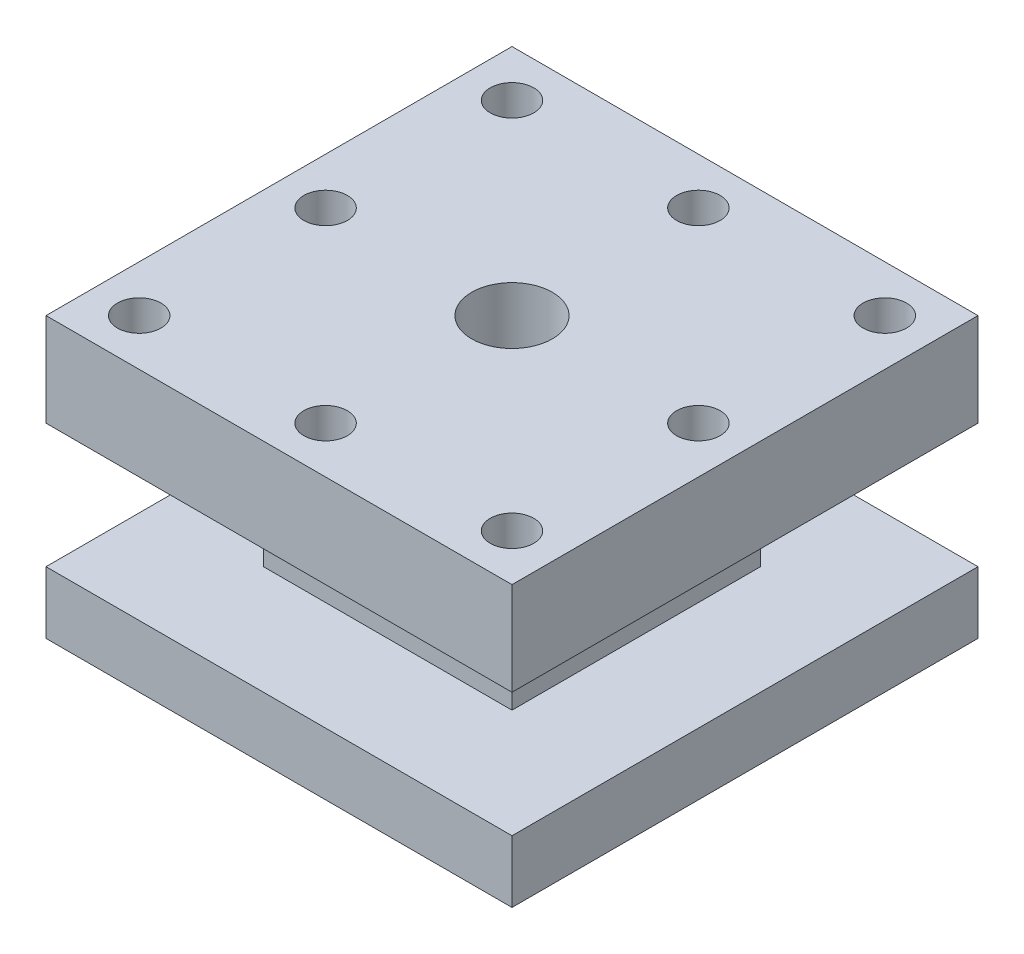
ISO-10303-21;
HEADER;
FILE_DESCRIPTION(('STEP AP214'),'2;1');
FILE_NAME('part.step','',(''),(''),'','','');
FILE_SCHEMA(('AUTOMOTIVE_DESIGN { 1 0 10303 214 1 1 1 1 }'));
ENDSEC;
DATA;
#1=APPLICATION_CONTEXT('core data for automotive mechanical design processes');
#2=APPLICATION_PROTOCOL_DEFINITION('international standard','automotive_design',2000,#1);
#3=PRODUCT_CONTEXT('',#1,'mechanical');
#4=PRODUCT('Part','Part','',(#3));
#5=PRODUCT_RELATED_PRODUCT_CATEGORY('part','',(#4));
#6=PRODUCT_DEFINITION_FORMATION('','',#4);
#7=PRODUCT_DEFINITION_CONTEXT('part definition',#1,'design');
#8=PRODUCT_DEFINITION('design','',#6,#7);
#9=PRODUCT_DEFINITION_SHAPE('','',#8);
#10=(LENGTH_UNIT() NAMED_UNIT(*) SI_UNIT(.MILLI.,.METRE.));
#11=(NAMED_UNIT(*) PLANE_ANGLE_UNIT() SI_UNIT($,.RADIAN.));
#12=(NAMED_UNIT(*) SI_UNIT($,.STERADIAN.) SOLID_ANGLE_UNIT());
#13=UNCERTAINTY_MEASURE_WITH_UNIT(LENGTH_MEASURE(1.E-05),#10,'distance_accuracy_value','');
#14=(GEOMETRIC_REPRESENTATION_CONTEXT(3) GLOBAL_UNCERTAINTY_ASSIGNED_CONTEXT((#13)) GLOBAL_UNIT_ASSIGNED_CONTEXT((#10,
#11,#12)) REPRESENTATION_CONTEXT('',''));
#15=CARTESIAN_POINT('',(0.,0.,0.));
#16=DIRECTION('',(0.,0.,1.));
#17=DIRECTION('',(1.,0.,0.));
#18=AXIS2_PLACEMENT_3D('',#15,#16,#17);
#19=CARTESIAN_POINT('',(0.,-30.,0.));
#20=DIRECTION('',(0.,1.,0.));
#21=DIRECTION('',(0.,0.,1.));
#22=AXIS2_PLACEMENT_3D('',#19,#20,#21);
#23=PLANE('',#22);
#24=CARTESIAN_POINT('',(60.,-30.,60.));
#25=DIRECTION('',(0.,1.,0.));
#26=DIRECTION('',(0.,0.,1.));
#27=AXIS2_PLACEMENT_3D('',#24,#25,#26);
#28=CIRCLE('',#27,7.);
#29=CARTESIAN_POINT('',(60.,-30.,67.));
#30=VERTEX_POINT('',#29);
#31=EDGE_CURVE('E176',#30,#30,#28,.T.);
#32=ORIENTED_EDGE('',*,*,#31,.T.);
#33=EDGE_LOOP('',(#32));
#34=FACE_BOUND('',#33,.T.);
#35=CARTESIAN_POINT('',(-60.,-30.,-60.));
#36=DIRECTION('',(0.,1.,0.));
#37=DIRECTION('',(0.,0.,1.));
#38=AXIS2_PLACEMENT_3D('',#35,#36,#37);
#39=CIRCLE('',#38,7.);
#40=CARTESIAN_POINT('',(-60.,-30.,-53.));
#41=VERTEX_POINT('',#40);
#42=EDGE_CURVE('E182',#41,#41,#39,.T.);
#43=ORIENTED_EDGE('',*,*,#42,.T.);
#44=EDGE_LOOP('',(#43));
#45=FACE_BOUND('',#44,.T.);
#46=CARTESIAN_POINT('',(-60.,-30.,60.));
#47=DIRECTION('',(0.,1.,0.));
#48=DIRECTION('',(0.,0.,1.));
#49=AXIS2_PLACEMENT_3D('',#46,#47,#48);
#50=CIRCLE('',#49,7.);
#51=CARTESIAN_POINT('',(-60.,-30.,67.));
#52=VERTEX_POINT('',#51);
#53=EDGE_CURVE('E188',#52,#52,#50,.T.);
#54=ORIENTED_EDGE('',*,*,#53,.T.);
#55=EDGE_LOOP('',(#54));
#56=FACE_BOUND('',#55,.T.);
#57=CARTESIAN_POINT('',(60.,-30.,-60.));
#58=DIRECTION('',(0.,1.,0.));
#59=DIRECTION('',(0.,0.,1.));
#60=AXIS2_PLACEMENT_3D('',#57,#58,#59);
#61=CIRCLE('',#60,7.);
#62=CARTESIAN_POINT('',(60.,-30.,-53.));
#63=VERTEX_POINT('',#62);
#64=EDGE_CURVE('E194',#63,#63,#61,.T.);
#65=ORIENTED_EDGE('',*,*,#64,.T.);
#66=EDGE_LOOP('',(#65));
#67=FACE_BOUND('',#66,.T.);
#68=CARTESIAN_POINT('',(0.,-30.,-60.));
#69=DIRECTION('',(0.,1.,0.));
#70=DIRECTION('',(0.,0.,1.));
#71=AXIS2_PLACEMENT_3D('',#68,#69,#70);
#72=CIRCLE('',#71,6.99999999999999);
#73=CARTESIAN_POINT('',(0.,-30.,-53.));
#74=VERTEX_POINT('',#73);
#75=EDGE_CURVE('E200',#74,#74,#72,.T.);
#76=ORIENTED_EDGE('',*,*,#75,.T.);
#77=EDGE_LOOP('',(#76));
#78=FACE_BOUND('',#77,.T.);
#79=CARTESIAN_POINT('',(-60.,-30.,0.));
#80=DIRECTION('',(0.,1.,0.));
#81=DIRECTION('',(0.,0.,1.));
#82=AXIS2_PLACEMENT_3D('',#79,#80,#81);
#83=CIRCLE('',#82,7.);
#84=CARTESIAN_POINT('',(-60.,-30.,6.99999999999999));
#85=VERTEX_POINT('',#84);
#86=EDGE_CURVE('E206',#85,#85,#83,.T.);
#87=ORIENTED_EDGE('',*,*,#86,.T.);
#88=EDGE_LOOP('',(#87));
#89=FACE_BOUND('',#88,.T.);
#90=CARTESIAN_POINT('',(0.,-30.,60.));
#91=DIRECTION('',(0.,1.,0.));
#92=DIRECTION('',(0.,0.,1.));
#93=AXIS2_PLACEMENT_3D('',#90,#91,#92);
#94=CIRCLE('',#93,6.99999999999999);
#95=CARTESIAN_POINT('',(0.,-30.,67.));
#96=VERTEX_POINT('',#95);
#97=EDGE_CURVE('E212',#96,#96,#94,.T.);
#98=ORIENTED_EDGE('',*,*,#97,.T.);
#99=EDGE_LOOP('',(#98));
#100=FACE_BOUND('',#99,.T.);
#101=CARTESIAN_POINT('',(60.,-30.,0.));
#102=DIRECTION('',(0.,1.,0.));
#103=DIRECTION('',(0.,0.,1.));
#104=AXIS2_PLACEMENT_3D('',#101,#102,#103);
#105=CIRCLE('',#104,6.99999999999999);
#106=CARTESIAN_POINT('',(60.,-30.,6.99999999999999));
#107=VERTEX_POINT('',#106);
#108=EDGE_CURVE('E218',#107,#107,#105,.T.);
#109=ORIENTED_EDGE('',*,*,#108,.T.);
#110=EDGE_LOOP('',(#109));
#111=FACE_BOUND('',#110,.T.);
#112=DIRECTION('',(0.,0.,-1.));
#113=VECTOR('',#112,1.);
#114=CARTESIAN_POINT('',(75.,-30.,-75.));
#115=LINE('',#114,#113);
#116=CARTESIAN_POINT('',(75.,-30.,75.));
#117=VERTEX_POINT('',#116);
#118=CARTESIAN_POINT('',(75.,-30.,-75.));
#119=VERTEX_POINT('',#118);
#120=EDGE_CURVE('E290',#117,#119,#115,.T.);
#121=ORIENTED_EDGE('',*,*,#120,.F.);
#122=DIRECTION('',(1.,0.,0.));
#123=VECTOR('',#122,1.);
#124=CARTESIAN_POINT('',(-75.,-30.,75.));
#125=LINE('',#124,#123);
#126=CARTESIAN_POINT('',(-75.,-30.,75.));
#127=VERTEX_POINT('',#126);
#128=EDGE_CURVE('E300',#127,#117,#125,.T.);
#129=ORIENTED_EDGE('',*,*,#128,.F.);
#130=DIRECTION('',(0.,0.,1.));
#131=VECTOR('',#130,1.);
#132=CARTESIAN_POINT('',(-75.,-30.,-75.));
#133=LINE('',#132,#131);
#134=CARTESIAN_POINT('',(-75.,-30.,-75.));
#135=VERTEX_POINT('',#134);
#136=EDGE_CURVE('E297',#135,#127,#133,.T.);
#137=ORIENTED_EDGE('',*,*,#136,.F.);
#138=DIRECTION('',(-1.,0.,0.));
#139=VECTOR('',#138,1.);
#140=CARTESIAN_POINT('',(-75.,-30.,-75.));
#141=LINE('',#140,#139);
#142=EDGE_CURVE('E293',#119,#135,#141,.T.);
#143=ORIENTED_EDGE('',*,*,#142,.F.);
#144=EDGE_LOOP('',(#121,#129,#137,#143));
#145=FACE_BOUND('',#144,.T.);
#146=DIRECTION('',(0.,0.,1.));
#147=VECTOR('',#146,1.);
#148=CARTESIAN_POINT('',(40.,-30.,40.));
#149=LINE('',#148,#147);
#150=CARTESIAN_POINT('',(40.,-30.,-40.));
#151=VERTEX_POINT('',#150);
#152=CARTESIAN_POINT('',(40.,-30.,40.));
#153=VERTEX_POINT('',#152);
#154=EDGE_CURVE('E58',#151,#153,#149,.T.);
#155=ORIENTED_EDGE('',*,*,#154,.F.);
#156=DIRECTION('',(1.,0.,0.));
#157=VECTOR('',#156,1.);
#158=CARTESIAN_POINT('',(-40.,-30.,-40.));
#159=LINE('',#158,#157);
#160=CARTESIAN_POINT('',(-40.,-30.,-40.));
#161=VERTEX_POINT('',#160);
#162=EDGE_CURVE('E62',#161,#151,#159,.T.);
#163=ORIENTED_EDGE('',*,*,#162,.F.);
#164=DIRECTION('',(0.,0.,-1.));
#165=VECTOR('',#164,1.);
#166=CARTESIAN_POINT('',(-40.,-30.,40.));
#167=LINE('',#166,#165);
#168=CARTESIAN_POINT('',(-40.,-30.,40.));
#169=VERTEX_POINT('',#168);
#170=EDGE_CURVE('E275',#169,#161,#167,.T.);
#171=ORIENTED_EDGE('',*,*,#170,.F.);
#172=DIRECTION('',(-1.,0.,0.));
#173=VECTOR('',#172,1.);
#174=CARTESIAN_POINT('',(-40.,-30.,40.));
#175=LINE('',#174,#173);
#176=EDGE_CURVE('E272',#153,#169,#175,.T.);
#177=ORIENTED_EDGE('',*,*,#176,.F.);
#178=EDGE_LOOP('',(#155,#163,#171,#177));
#179=FACE_BOUND('',#178,.T.);
#180=ADVANCED_FACE('F42',(#34,#45,#56,#67,#78,#89,#100,#111,#145,#179),#23,.F.);
#181=CARTESIAN_POINT('',(75.,-30.,-75.));
#182=DIRECTION('',(1.,0.,0.));
#183=DIRECTION('',(0.,0.,-1.));
#184=AXIS2_PLACEMENT_3D('',#181,#182,#183);
#185=PLANE('',#184);
#186=DIRECTION('',(0.,0.,-1.));
#187=VECTOR('',#186,1.);
#188=CARTESIAN_POINT('',(75.,0.,-75.));
#189=LINE('',#188,#187);
#190=CARTESIAN_POINT('',(75.,0.,75.));
#191=VERTEX_POINT('',#190);
#192=CARTESIAN_POINT('',(75.,0.,-75.));
#193=VERTEX_POINT('',#192);
#194=EDGE_CURVE('E289',#191,#193,#189,.T.);
#195=ORIENTED_EDGE('',*,*,#194,.F.);
#196=DIRECTION('',(0.,1.,0.));
#197=VECTOR('',#196,1.);
#198=CARTESIAN_POINT('',(75.,-30.,75.));
#199=LINE('',#198,#197);
#200=EDGE_CURVE('E314',#117,#191,#199,.T.);
#201=ORIENTED_EDGE('',*,*,#200,.F.);
#202=ORIENTED_EDGE('',*,*,#120,.T.);
#203=DIRECTION('',(0.,1.,0.));
#204=VECTOR('',#203,1.);
#205=CARTESIAN_POINT('',(75.,-30.,-75.));
#206=LINE('',#205,#204);
#207=EDGE_CURVE('E303',#119,#193,#206,.T.);
#208=ORIENTED_EDGE('',*,*,#207,.T.);
#209=EDGE_LOOP('',(#195,#201,#202,#208));
#210=FACE_BOUND('',#209,.T.);
#211=ADVANCED_FACE('F336',(#210),#185,.T.);
#212=CARTESIAN_POINT('',(-75.,-30.,75.));
#213=DIRECTION('',(0.,0.,1.));
#214=DIRECTION('',(1.,0.,0.));
#215=AXIS2_PLACEMENT_3D('',#212,#213,#214);
#216=PLANE('',#215);
#217=DIRECTION('',(1.,0.,0.));
#218=VECTOR('',#217,1.);
#219=CARTESIAN_POINT('',(-75.,0.,75.));
#220=LINE('',#219,#218);
#221=CARTESIAN_POINT('',(-75.,0.,75.));
#222=VERTEX_POINT('',#221);
#223=EDGE_CURVE('E294',#222,#191,#220,.T.);
#224=ORIENTED_EDGE('',*,*,#223,.F.);
#225=DIRECTION('',(0.,1.,0.));
#226=VECTOR('',#225,1.);
#227=CARTESIAN_POINT('',(-75.,-30.,75.));
#228=LINE('',#227,#226);
#229=EDGE_CURVE('E316',#127,#222,#228,.T.);
#230=ORIENTED_EDGE('',*,*,#229,.F.);
#231=ORIENTED_EDGE('',*,*,#128,.T.);
#232=ORIENTED_EDGE('',*,*,#200,.T.);
#233=EDGE_LOOP('',(#224,#230,#231,#232));
#234=FACE_BOUND('',#233,.T.);
#235=ADVANCED_FACE('F342',(#234),#216,.T.);
#236=CARTESIAN_POINT('',(-75.,-30.,-75.));
#237=DIRECTION('',(-1.,0.,0.));
#238=DIRECTION('',(0.,0.,1.));
#239=AXIS2_PLACEMENT_3D('',#236,#237,#238);
#240=PLANE('',#239);
#241=DIRECTION('',(0.,0.,1.));
#242=VECTOR('',#241,1.);
#243=CARTESIAN_POINT('',(-75.,0.,-75.));
#244=LINE('',#243,#242);
#245=CARTESIAN_POINT('',(-75.,0.,-75.));
#246=VERTEX_POINT('',#245);
#247=EDGE_CURVE('E309',#246,#222,#244,.T.);
#248=ORIENTED_EDGE('',*,*,#247,.F.);
#249=DIRECTION('',(0.,1.,0.));
#250=VECTOR('',#249,1.);
#251=CARTESIAN_POINT('',(-75.,-30.,-75.));
#252=LINE('',#251,#250);
#253=EDGE_CURVE('E318',#135,#246,#252,.T.);
#254=ORIENTED_EDGE('',*,*,#253,.F.);
#255=ORIENTED_EDGE('',*,*,#136,.T.);
#256=ORIENTED_EDGE('',*,*,#229,.T.);
#257=EDGE_LOOP('',(#248,#254,#255,#256));
#258=FACE_BOUND('',#257,.T.);
#259=ADVANCED_FACE('F356',(#258),#240,.T.);
#260=CARTESIAN_POINT('',(-75.,-30.,-75.));
#261=DIRECTION('',(0.,0.,-1.));
#262=DIRECTION('',(-1.,0.,0.));
#263=AXIS2_PLACEMENT_3D('',#260,#261,#262);
#264=PLANE('',#263);
#265=DIRECTION('',(-1.,0.,0.));
#266=VECTOR('',#265,1.);
#267=CARTESIAN_POINT('',(-75.,0.,-75.));
#268=LINE('',#267,#266);
#269=EDGE_CURVE('E306',#193,#246,#268,.T.);
#270=ORIENTED_EDGE('',*,*,#269,.F.);
#271=ORIENTED_EDGE('',*,*,#207,.F.);
#272=ORIENTED_EDGE('',*,*,#142,.T.);
#273=ORIENTED_EDGE('',*,*,#253,.T.);
#274=EDGE_LOOP('',(#270,#271,#272,#273));
#275=FACE_BOUND('',#274,.T.);
#276=ADVANCED_FACE('F352',(#275),#264,.T.);
#277=CARTESIAN_POINT('',(0.,0.,0.));
#278=DIRECTION('',(0.,1.,0.));
#279=DIRECTION('',(0.,0.,1.));
#280=AXIS2_PLACEMENT_3D('',#277,#278,#279);
#281=PLANE('',#280);
#282=CARTESIAN_POINT('',(60.,0.,60.));
#283=DIRECTION('',(0.,1.,0.));
#284=DIRECTION('',(0.,0.,1.));
#285=AXIS2_PLACEMENT_3D('',#282,#283,#284);
#286=CIRCLE('',#285,7.);
#287=CARTESIAN_POINT('',(60.,0.,67.));
#288=VERTEX_POINT('',#287);
#289=EDGE_CURVE('E173',#288,#288,#286,.T.);
#290=ORIENTED_EDGE('',*,*,#289,.F.);
#291=EDGE_LOOP('',(#290));
#292=FACE_BOUND('',#291,.T.);
#293=CARTESIAN_POINT('',(-60.,0.,-60.));
#294=DIRECTION('',(0.,1.,0.));
#295=DIRECTION('',(0.,0.,1.));
#296=AXIS2_PLACEMENT_3D('',#293,#294,#295);
#297=CIRCLE('',#296,7.);
#298=CARTESIAN_POINT('',(-60.,0.,-53.));
#299=VERTEX_POINT('',#298);
#300=EDGE_CURVE('E179',#299,#299,#297,.T.);
#301=ORIENTED_EDGE('',*,*,#300,.F.);
#302=EDGE_LOOP('',(#301));
#303=FACE_BOUND('',#302,.T.);
#304=CARTESIAN_POINT('',(-60.,0.,60.));
#305=DIRECTION('',(0.,1.,0.));
#306=DIRECTION('',(0.,0.,1.));
#307=AXIS2_PLACEMENT_3D('',#304,#305,#306);
#308=CIRCLE('',#307,7.);
#309=CARTESIAN_POINT('',(-60.,0.,67.));
#310=VERTEX_POINT('',#309);
#311=EDGE_CURVE('E185',#310,#310,#308,.T.);
#312=ORIENTED_EDGE('',*,*,#311,.F.);
#313=EDGE_LOOP('',(#312));
#314=FACE_BOUND('',#313,.T.);
#315=CARTESIAN_POINT('',(60.,0.,-60.));
#316=DIRECTION('',(0.,1.,0.));
#317=DIRECTION('',(0.,0.,1.));
#318=AXIS2_PLACEMENT_3D('',#315,#316,#317);
#319=CIRCLE('',#318,7.);
#320=CARTESIAN_POINT('',(60.,0.,-53.));
#321=VERTEX_POINT('',#320);
#322=EDGE_CURVE('E191',#321,#321,#319,.T.);
#323=ORIENTED_EDGE('',*,*,#322,.F.);
#324=EDGE_LOOP('',(#323));
#325=FACE_BOUND('',#324,.T.);
#326=CARTESIAN_POINT('',(0.,0.,-60.));
#327=DIRECTION('',(0.,1.,0.));
#328=DIRECTION('',(0.,0.,1.));
#329=AXIS2_PLACEMENT_3D('',#326,#327,#328);
#330=CIRCLE('',#329,7.);
#331=CARTESIAN_POINT('',(0.,0.,-53.));
#332=VERTEX_POINT('',#331);
#333=EDGE_CURVE('E197',#332,#332,#330,.T.);
#334=ORIENTED_EDGE('',*,*,#333,.F.);
#335=EDGE_LOOP('',(#334));
#336=FACE_BOUND('',#335,.T.);
#337=CARTESIAN_POINT('',(-60.,0.,0.));
#338=DIRECTION('',(0.,1.,0.));
#339=DIRECTION('',(0.,0.,1.));
#340=AXIS2_PLACEMENT_3D('',#337,#338,#339);
#341=CIRCLE('',#340,7.);
#342=CARTESIAN_POINT('',(-60.,0.,6.99999999999999));
#343=VERTEX_POINT('',#342);
#344=EDGE_CURVE('E203',#343,#343,#341,.T.);
#345=ORIENTED_EDGE('',*,*,#344,.F.);
#346=EDGE_LOOP('',(#345));
#347=FACE_BOUND('',#346,.T.);
#348=CARTESIAN_POINT('',(0.,0.,60.));
#349=DIRECTION('',(0.,1.,0.));
#350=DIRECTION('',(0.,0.,1.));
#351=AXIS2_PLACEMENT_3D('',#348,#349,#350);
#352=CIRCLE('',#351,7.);
#353=CARTESIAN_POINT('',(0.,0.,67.));
#354=VERTEX_POINT('',#353);
#355=EDGE_CURVE('E209',#354,#354,#352,.T.);
#356=ORIENTED_EDGE('',*,*,#355,.F.);
#357=EDGE_LOOP('',(#356));
#358=FACE_BOUND('',#357,.T.);
#359=CARTESIAN_POINT('',(60.,0.,0.));
#360=DIRECTION('',(0.,1.,0.));
#361=DIRECTION('',(0.,0.,1.));
#362=AXIS2_PLACEMENT_3D('',#359,#360,#361);
#363=CIRCLE('',#362,6.99999999999999);
#364=CARTESIAN_POINT('',(60.,0.,6.99999999999999));
#365=VERTEX_POINT('',#364);
#366=EDGE_CURVE('E215',#365,#365,#363,.T.);
#367=ORIENTED_EDGE('',*,*,#366,.F.);
#368=EDGE_LOOP('',(#367));
#369=FACE_BOUND('',#368,.T.);
#370=CARTESIAN_POINT('',(0.,0.,0.));
#371=DIRECTION('',(0.,1.,0.));
#372=DIRECTION('',(0.,0.,1.));
#373=AXIS2_PLACEMENT_3D('',#370,#371,#372);
#374=CIRCLE('',#373,13.);
#375=CARTESIAN_POINT('',(0.,0.,13.));
#376=VERTEX_POINT('',#375);
#377=EDGE_CURVE('E227',#376,#376,#374,.T.);
#378=ORIENTED_EDGE('',*,*,#377,.F.);
#379=EDGE_LOOP('',(#378));
#380=FACE_BOUND('',#379,.T.);
#381=ORIENTED_EDGE('',*,*,#194,.T.);
#382=ORIENTED_EDGE('',*,*,#269,.T.);
#383=ORIENTED_EDGE('',*,*,#247,.T.);
#384=ORIENTED_EDGE('',*,*,#223,.T.);
#385=EDGE_LOOP('',(#381,#382,#383,#384));
#386=FACE_BOUND('',#385,.T.);
#387=ADVANCED_FACE('F349',(#292,#303,#314,#325,#336,#347,#358,#369,#380,#386),#281,.T.);
#388=CARTESIAN_POINT('',(40.,-70.,40.));
#389=DIRECTION('',(-1.,0.,0.));
#390=DIRECTION('',(0.,0.,1.));
#391=AXIS2_PLACEMENT_3D('',#388,#389,#390);
#392=PLANE('',#391);
#393=ORIENTED_EDGE('',*,*,#154,.T.);
#394=DIRECTION('',(0.,1.,0.));
#395=VECTOR('',#394,1.);
#396=CARTESIAN_POINT('',(40.,-70.,40.));
#397=LINE('',#396,#395);
#398=CARTESIAN_POINT('',(40.,-70.,40.));
#399=VERTEX_POINT('',#398);
#400=EDGE_CURVE('E286',#399,#153,#397,.T.);
#401=ORIENTED_EDGE('',*,*,#400,.F.);
#402=DIRECTION('',(0.,0.,1.));
#403=VECTOR('',#402,1.);
#404=CARTESIAN_POINT('',(40.,-70.,40.));
#405=LINE('',#404,#403);
#406=CARTESIAN_POINT('',(40.,-70.,-40.));
#407=VERTEX_POINT('',#406);
#408=EDGE_CURVE('E258',#407,#399,#405,.T.);
#409=ORIENTED_EDGE('',*,*,#408,.F.);
#410=DIRECTION('',(0.,1.,0.));
#411=VECTOR('',#410,1.);
#412=CARTESIAN_POINT('',(40.,-70.,-40.));
#413=LINE('',#412,#411);
#414=EDGE_CURVE('E270',#407,#151,#413,.T.);
#415=ORIENTED_EDGE('',*,*,#414,.T.);
#416=EDGE_LOOP('',(#393,#401,#409,#415));
#417=FACE_BOUND('',#416,.T.);
#418=ADVANCED_FACE('F347',(#417),#392,.F.);
#419=CARTESIAN_POINT('',(-40.,-70.,40.));
#420=DIRECTION('',(0.,0.,-1.));
#421=DIRECTION('',(-1.,0.,0.));
#422=AXIS2_PLACEMENT_3D('',#419,#420,#421);
#423=PLANE('',#422);
#424=ORIENTED_EDGE('',*,*,#176,.T.);
#425=DIRECTION('',(0.,1.,0.));
#426=VECTOR('',#425,1.);
#427=CARTESIAN_POINT('',(-40.,-70.,40.));
#428=LINE('',#427,#426);
#429=CARTESIAN_POINT('',(-40.,-70.,40.));
#430=VERTEX_POINT('',#429);
#431=EDGE_CURVE('E283',#430,#169,#428,.T.);
#432=ORIENTED_EDGE('',*,*,#431,.F.);
#433=DIRECTION('',(-1.,0.,0.));
#434=VECTOR('',#433,1.);
#435=CARTESIAN_POINT('',(-40.,-70.,40.));
#436=LINE('',#435,#434);
#437=EDGE_CURVE('E261',#399,#430,#436,.T.);
#438=ORIENTED_EDGE('',*,*,#437,.F.);
#439=ORIENTED_EDGE('',*,*,#400,.T.);
#440=EDGE_LOOP('',(#424,#432,#438,#439));
#441=FACE_BOUND('',#440,.T.);
#442=ADVANCED_FACE('F389',(#441),#423,.F.);
#443=CARTESIAN_POINT('',(-40.,-70.,40.));
#444=DIRECTION('',(1.,0.,0.));
#445=DIRECTION('',(0.,0.,-1.));
#446=AXIS2_PLACEMENT_3D('',#443,#444,#445);
#447=PLANE('',#446);
#448=ORIENTED_EDGE('',*,*,#170,.T.);
#449=DIRECTION('',(0.,1.,0.));
#450=VECTOR('',#449,1.);
#451=CARTESIAN_POINT('',(-40.,-70.,-40.));
#452=LINE('',#451,#450);
#453=CARTESIAN_POINT('',(-40.,-70.,-40.));
#454=VERTEX_POINT('',#453);
#455=EDGE_CURVE('E280',#454,#161,#452,.T.);
#456=ORIENTED_EDGE('',*,*,#455,.F.);
#457=DIRECTION('',(0.,0.,-1.));
#458=VECTOR('',#457,1.);
#459=CARTESIAN_POINT('',(-40.,-70.,40.));
#460=LINE('',#459,#458);
#461=EDGE_CURVE('E264',#430,#454,#460,.T.);
#462=ORIENTED_EDGE('',*,*,#461,.F.);
#463=ORIENTED_EDGE('',*,*,#431,.T.);
#464=EDGE_LOOP('',(#448,#456,#462,#463));
#465=FACE_BOUND('',#464,.T.);
#466=ADVANCED_FACE('F396',(#465),#447,.F.);
#467=CARTESIAN_POINT('',(-40.,-70.,-40.));
#468=DIRECTION('',(0.,0.,1.));
#469=DIRECTION('',(1.,0.,0.));
#470=AXIS2_PLACEMENT_3D('',#467,#468,#469);
#471=PLANE('',#470);
#472=ORIENTED_EDGE('',*,*,#162,.T.);
#473=ORIENTED_EDGE('',*,*,#414,.F.);
#474=DIRECTION('',(1.,0.,0.));
#475=VECTOR('',#474,1.);
#476=CARTESIAN_POINT('',(-40.,-70.,-40.));
#477=LINE('',#476,#475);
#478=EDGE_CURVE('E267',#454,#407,#477,.T.);
#479=ORIENTED_EDGE('',*,*,#478,.F.);
#480=ORIENTED_EDGE('',*,*,#455,.T.);
#481=EDGE_LOOP('',(#472,#473,#479,#480));
#482=FACE_BOUND('',#481,.T.);
#483=ADVANCED_FACE('F403',(#482),#471,.F.);
#484=CARTESIAN_POINT('',(0.,-70.,0.));
#485=DIRECTION('',(0.,-1.,0.));
#486=DIRECTION('',(0.,0.,-1.));
#487=AXIS2_PLACEMENT_3D('',#484,#485,#486);
#488=PLANE('',#487);
#489=DIRECTION('',(0.,0.,-1.));
#490=VECTOR('',#489,1.);
#491=CARTESIAN_POINT('',(-75.,-70.,75.));
#492=LINE('',#491,#490);
#493=CARTESIAN_POINT('',(-75.,-70.,75.));
#494=VERTEX_POINT('',#493);
#495=CARTESIAN_POINT('',(-75.,-70.,-75.));
#496=VERTEX_POINT('',#495);
#497=EDGE_CURVE('E239',#494,#496,#492,.T.);
#498=ORIENTED_EDGE('',*,*,#497,.F.);
#499=DIRECTION('',(-1.,0.,0.));
#500=VECTOR('',#499,1.);
#501=CARTESIAN_POINT('',(75.,-70.,75.));
#502=LINE('',#501,#500);
#503=CARTESIAN_POINT('',(75.,-70.,75.));
#504=VERTEX_POINT('',#503);
#505=EDGE_CURVE('E232',#504,#494,#502,.T.);
#506=ORIENTED_EDGE('',*,*,#505,.F.);
#507=DIRECTION('',(0.,0.,1.));
#508=VECTOR('',#507,1.);
#509=CARTESIAN_POINT('',(75.,-70.,-75.));
#510=LINE('',#509,#508);
#511=CARTESIAN_POINT('',(75.,-70.,-75.));
#512=VERTEX_POINT('',#511);
#513=EDGE_CURVE('E244',#512,#504,#510,.T.);
#514=ORIENTED_EDGE('',*,*,#513,.F.);
#515=DIRECTION('',(1.,0.,0.));
#516=VECTOR('',#515,1.);
#517=CARTESIAN_POINT('',(-75.,-70.,-75.));
#518=LINE('',#517,#516);
#519=EDGE_CURVE('E242',#496,#512,#518,.T.);
#520=ORIENTED_EDGE('',*,*,#519,.F.);
#521=EDGE_LOOP('',(#498,#506,#514,#520));
#522=FACE_BOUND('',#521,.T.);
#523=ORIENTED_EDGE('',*,*,#478,.T.);
#524=ORIENTED_EDGE('',*,*,#408,.T.);
#525=ORIENTED_EDGE('',*,*,#437,.T.);
#526=ORIENTED_EDGE('',*,*,#461,.T.);
#527=EDGE_LOOP('',(#523,#524,#525,#526));
#528=FACE_BOUND('',#527,.T.);
#529=ADVANCED_FACE('F411',(#522,#528),#488,.F.);
#530=CARTESIAN_POINT('',(-75.,-90.,75.));
#531=DIRECTION('',(1.,0.,0.));
#532=DIRECTION('',(0.,0.,-1.));
#533=AXIS2_PLACEMENT_3D('',#530,#531,#532);
#534=PLANE('',#533);
#535=ORIENTED_EDGE('',*,*,#497,.T.);
#536=DIRECTION('',(0.,1.,0.));
#537=VECTOR('',#536,1.);
#538=CARTESIAN_POINT('',(-75.,-90.,-75.));
#539=LINE('',#538,#537);
#540=CARTESIAN_POINT('',(-75.,-90.,-75.));
#541=VERTEX_POINT('',#540);
#542=EDGE_CURVE('E255',#541,#496,#539,.T.);
#543=ORIENTED_EDGE('',*,*,#542,.F.);
#544=DIRECTION('',(0.,0.,-1.));
#545=VECTOR('',#544,1.);
#546=CARTESIAN_POINT('',(-75.,-90.,75.));
#547=LINE('',#546,#545);
#548=CARTESIAN_POINT('',(-75.,-90.,75.));
#549=VERTEX_POINT('',#548);
#550=EDGE_CURVE('E228',#549,#541,#547,.T.);
#551=ORIENTED_EDGE('',*,*,#550,.F.);
#552=DIRECTION('',(0.,1.,0.));
#553=VECTOR('',#552,1.);
#554=CARTESIAN_POINT('',(-75.,-90.,75.));
#555=LINE('',#554,#553);
#556=EDGE_CURVE('E238',#549,#494,#555,.T.);
#557=ORIENTED_EDGE('',*,*,#556,.T.);
#558=EDGE_LOOP('',(#535,#543,#551,#557));
#559=FACE_BOUND('',#558,.T.);
#560=ADVANCED_FACE('F419',(#559),#534,.F.);
#561=CARTESIAN_POINT('',(-75.,-90.,-75.));
#562=DIRECTION('',(0.,0.,1.));
#563=DIRECTION('',(1.,0.,0.));
#564=AXIS2_PLACEMENT_3D('',#561,#562,#563);
#565=PLANE('',#564);
#566=ORIENTED_EDGE('',*,*,#519,.T.);
#567=DIRECTION('',(0.,1.,0.));
#568=VECTOR('',#567,1.);
#569=CARTESIAN_POINT('',(75.,-90.,-75.));
#570=LINE('',#569,#568);
#571=CARTESIAN_POINT('',(75.,-90.,-75.));
#572=VERTEX_POINT('',#571);
#573=EDGE_CURVE('E252',#572,#512,#570,.T.);
#574=ORIENTED_EDGE('',*,*,#573,.F.);
#575=DIRECTION('',(1.,0.,0.));
#576=VECTOR('',#575,1.);
#577=CARTESIAN_POINT('',(-75.,-90.,-75.));
#578=LINE('',#577,#576);
#579=EDGE_CURVE('E231',#541,#572,#578,.T.);
#580=ORIENTED_EDGE('',*,*,#579,.F.);
#581=ORIENTED_EDGE('',*,*,#542,.T.);
#582=EDGE_LOOP('',(#566,#574,#580,#581));
#583=FACE_BOUND('',#582,.T.);
#584=ADVANCED_FACE('F427',(#583),#565,.F.);
#585=CARTESIAN_POINT('',(75.,-90.,-75.));
#586=DIRECTION('',(-1.,0.,0.));
#587=DIRECTION('',(0.,0.,1.));
#588=AXIS2_PLACEMENT_3D('',#585,#586,#587);
#589=PLANE('',#588);
#590=ORIENTED_EDGE('',*,*,#513,.T.);
#591=DIRECTION('',(0.,1.,0.));
#592=VECTOR('',#591,1.);
#593=CARTESIAN_POINT('',(75.,-90.,75.));
#594=LINE('',#593,#592);
#595=CARTESIAN_POINT('',(75.,-90.,75.));
#596=VERTEX_POINT('',#595);
#597=EDGE_CURVE('E249',#596,#504,#594,.T.);
#598=ORIENTED_EDGE('',*,*,#597,.F.);
#599=DIRECTION('',(0.,0.,1.));
#600=VECTOR('',#599,1.);
#601=CARTESIAN_POINT('',(75.,-90.,-75.));
#602=LINE('',#601,#600);
#603=EDGE_CURVE('E234',#572,#596,#602,.T.);
#604=ORIENTED_EDGE('',*,*,#603,.F.);
#605=ORIENTED_EDGE('',*,*,#573,.T.);
#606=EDGE_LOOP('',(#590,#598,#604,#605));
#607=FACE_BOUND('',#606,.T.);
#608=ADVANCED_FACE('F435',(#607),#589,.F.);
#609=CARTESIAN_POINT('',(75.,-90.,75.));
#610=DIRECTION('',(0.,0.,-1.));
#611=DIRECTION('',(-1.,0.,0.));
#612=AXIS2_PLACEMENT_3D('',#609,#610,#611);
#613=PLANE('',#612);
#614=ORIENTED_EDGE('',*,*,#505,.T.);
#615=ORIENTED_EDGE('',*,*,#556,.F.);
#616=DIRECTION('',(-1.,0.,0.));
#617=VECTOR('',#616,1.);
#618=CARTESIAN_POINT('',(75.,-90.,75.));
#619=LINE('',#618,#617);
#620=EDGE_CURVE('E236',#596,#549,#619,.T.);
#621=ORIENTED_EDGE('',*,*,#620,.F.);
#622=ORIENTED_EDGE('',*,*,#597,.T.);
#623=EDGE_LOOP('',(#614,#615,#621,#622));
#624=FACE_BOUND('',#623,.T.);
#625=ADVANCED_FACE('F443',(#624),#613,.F.);
#626=CARTESIAN_POINT('',(0.,-90.,0.));
#627=DIRECTION('',(0.,-1.,0.));
#628=DIRECTION('',(0.,0.,-1.));
#629=AXIS2_PLACEMENT_3D('',#626,#627,#628);
#630=PLANE('',#629);
#631=CARTESIAN_POINT('',(0.,-90.,0.));
#632=DIRECTION('',(0.,-1.,0.));
#633=DIRECTION('',(0.,0.,-1.));
#634=AXIS2_PLACEMENT_3D('',#631,#632,#633);
#635=CIRCLE('',#634,32.0000000000001);
#636=CARTESIAN_POINT('',(0.,-90.,-32.0000000000001));
#637=VERTEX_POINT('',#636);
#638=EDGE_CURVE('E11',#637,#637,#635,.F.);
#639=ORIENTED_EDGE('',*,*,#638,.T.);
#640=EDGE_LOOP('',(#639));
#641=FACE_BOUND('',#640,.T.);
#642=CARTESIAN_POINT('',(0.,-90.,52.));
#643=DIRECTION('',(0.,-1.,0.));
#644=DIRECTION('',(0.,0.,-1.));
#645=AXIS2_PLACEMENT_3D('',#642,#643,#644);
#646=CIRCLE('',#645,4.99999999999999);
#647=CARTESIAN_POINT('',(0.,-90.,47.));
#648=VERTEX_POINT('',#647);
#649=EDGE_CURVE('E151',#648,#648,#646,.T.);
#650=ORIENTED_EDGE('',*,*,#649,.F.);
#651=EDGE_LOOP('',(#650));
#652=FACE_BOUND('',#651,.T.);
#653=CARTESIAN_POINT('',(-52.,-90.,0.));
#654=DIRECTION('',(0.,-1.,0.));
#655=DIRECTION('',(0.,0.,-1.));
#656=AXIS2_PLACEMENT_3D('',#653,#654,#655);
#657=CIRCLE('',#656,4.99999999999999);
#658=CARTESIAN_POINT('',(-52.,-90.,-5.00000000000001));
#659=VERTEX_POINT('',#658);
#660=EDGE_CURVE('E150',#659,#659,#657,.T.);
#661=ORIENTED_EDGE('',*,*,#660,.F.);
#662=EDGE_LOOP('',(#661));
#663=FACE_BOUND('',#662,.T.);
#664=CARTESIAN_POINT('',(0.,-90.,-52.));
#665=DIRECTION('',(0.,-1.,0.));
#666=DIRECTION('',(0.,0.,-1.));
#667=AXIS2_PLACEMENT_3D('',#664,#665,#666);
#668=CIRCLE('',#667,4.99999999999999);
#669=CARTESIAN_POINT('',(0.,-90.,-57.));
#670=VERTEX_POINT('',#669);
#671=EDGE_CURVE('E161',#670,#670,#668,.T.);
#672=ORIENTED_EDGE('',*,*,#671,.F.);
#673=EDGE_LOOP('',(#672));
#674=FACE_BOUND('',#673,.T.);
#675=CARTESIAN_POINT('',(52.,-90.,0.));
#676=DIRECTION('',(0.,-1.,0.));
#677=DIRECTION('',(0.,0.,-1.));
#678=AXIS2_PLACEMENT_3D('',#675,#676,#677);
#679=CIRCLE('',#678,4.99999999999999);
#680=CARTESIAN_POINT('',(52.,-90.,-5.00000000000001));
#681=VERTEX_POINT('',#680);
#682=EDGE_CURVE('E167',#681,#681,#679,.T.);
#683=ORIENTED_EDGE('',*,*,#682,.F.);
#684=EDGE_LOOP('',(#683));
#685=FACE_BOUND('',#684,.T.);
#686=ORIENTED_EDGE('',*,*,#550,.T.);
#687=ORIENTED_EDGE('',*,*,#579,.T.);
#688=ORIENTED_EDGE('',*,*,#603,.T.);
#689=ORIENTED_EDGE('',*,*,#620,.T.);
#690=EDGE_LOOP('',(#686,#687,#688,#689));
#691=FACE_BOUND('',#690,.T.);
#692=ADVANCED_FACE('F451',(#641,#652,#663,#674,#685,#691),#630,.T.);
#693=CARTESIAN_POINT('',(0.,-90.,0.));
#694=DIRECTION('',(0.,-1.,0.));
#695=DIRECTION('',(0.,0.,-1.));
#696=AXIS2_PLACEMENT_3D('',#693,#694,#695);
#697=CYLINDRICAL_SURFACE('',#696,13.);
#698=ORIENTED_EDGE('',*,*,#377,.T.);
#699=EDGE_LOOP('',(#698));
#700=FACE_BOUND('',#699,.T.);
#701=CARTESIAN_POINT('',(0.,-80.,0.));
#702=DIRECTION('',(0.,-1.,0.));
#703=DIRECTION('',(0.,0.,-1.));
#704=AXIS2_PLACEMENT_3D('',#701,#702,#703);
#705=CIRCLE('',#704,13.);
#706=CARTESIAN_POINT('',(0.,-80.,-13.));
#707=VERTEX_POINT('',#706);
#708=EDGE_CURVE('E224',#707,#707,#705,.T.);
#709=ORIENTED_EDGE('',*,*,#708,.T.);
#710=EDGE_LOOP('',(#709));
#711=FACE_BOUND('',#710,.T.);
#712=ADVANCED_FACE('F460',(#700,#711),#697,.F.);
#713=CARTESIAN_POINT('',(13.,-80.,0.));
#714=DIRECTION('',(0.,1.,0.));
#715=DIRECTION('',(0.,0.,1.));
#716=AXIS2_PLACEMENT_3D('',#713,#714,#715);
#717=PLANE('',#716);
#718=ORIENTED_EDGE('',*,*,#708,.F.);
#719=EDGE_LOOP('',(#718));
#720=FACE_BOUND('',#719,.T.);
#721=CARTESIAN_POINT('',(0.,-80.,0.));
#722=DIRECTION('',(0.,-1.,0.));
#723=DIRECTION('',(0.,0.,-1.));
#724=AXIS2_PLACEMENT_3D('',#721,#722,#723);
#725=CIRCLE('',#724,30.);
#726=CARTESIAN_POINT('',(0.,-80.,-30.));
#727=VERTEX_POINT('',#726);
#728=EDGE_CURVE('E221',#727,#727,#725,.T.);
#729=ORIENTED_EDGE('',*,*,#728,.T.);
#730=EDGE_LOOP('',(#729));
#731=FACE_BOUND('',#730,.T.);
#732=ADVANCED_FACE('F469',(#720,#731),#717,.F.);
#733=CARTESIAN_POINT('',(0.,-90.,0.));
#734=DIRECTION('',(0.,-1.,0.));
#735=DIRECTION('',(0.,0.,-1.));
#736=AXIS2_PLACEMENT_3D('',#733,#734,#735);
#737=CYLINDRICAL_SURFACE('',#736,30.);
#738=CARTESIAN_POINT('',(0.,-87.9999999999999,0.));
#739=DIRECTION('',(0.,-1.,0.));
#740=DIRECTION('',(0.,0.,-1.));
#741=AXIS2_PLACEMENT_3D('',#738,#739,#740);
#742=CIRCLE('',#741,30.);
#743=CARTESIAN_POINT('',(0.,-87.9999999999999,-30.));
#744=VERTEX_POINT('',#743);
#745=EDGE_CURVE('E51',#744,#744,#742,.T.);
#746=ORIENTED_EDGE('',*,*,#745,.T.);
#747=EDGE_LOOP('',(#746));
#748=FACE_BOUND('',#747,.T.);
#749=ORIENTED_EDGE('',*,*,#728,.F.);
#750=EDGE_LOOP('',(#749));
#751=FACE_BOUND('',#750,.T.);
#752=ADVANCED_FACE('F325',(#748,#751),#737,.F.);
#753=CARTESIAN_POINT('',(60.,0.,0.));
#754=DIRECTION('',(0.,1.,0.));
#755=DIRECTION('',(0.,0.,1.));
#756=AXIS2_PLACEMENT_3D('',#753,#754,#755);
#757=CYLINDRICAL_SURFACE('',#756,6.99999999999999);
#758=ORIENTED_EDGE('',*,*,#108,.F.);
#759=EDGE_LOOP('',(#758));
#760=FACE_BOUND('',#759,.T.);
#761=ORIENTED_EDGE('',*,*,#366,.T.);
#762=EDGE_LOOP('',(#761));
#763=FACE_BOUND('',#762,.T.);
#764=ADVANCED_FACE('F483',(#760,#763),#757,.F.);
#765=CARTESIAN_POINT('',(0.,0.,60.));
#766=DIRECTION('',(0.,1.,0.));
#767=DIRECTION('',(0.,0.,1.));
#768=AXIS2_PLACEMENT_3D('',#765,#766,#767);
#769=CYLINDRICAL_SURFACE('',#768,6.99999999999999);
#770=ORIENTED_EDGE('',*,*,#97,.F.);
#771=EDGE_LOOP('',(#770));
#772=FACE_BOUND('',#771,.T.);
#773=ORIENTED_EDGE('',*,*,#355,.T.);
#774=EDGE_LOOP('',(#773));
#775=FACE_BOUND('',#774,.T.);
#776=ADVANCED_FACE('F489',(#772,#775),#769,.F.);
#777=CARTESIAN_POINT('',(-60.,0.,0.));
#778=DIRECTION('',(0.,1.,0.));
#779=DIRECTION('',(0.,0.,1.));
#780=AXIS2_PLACEMENT_3D('',#777,#778,#779);
#781=CYLINDRICAL_SURFACE('',#780,7.);
#782=ORIENTED_EDGE('',*,*,#86,.F.);
#783=EDGE_LOOP('',(#782));
#784=FACE_BOUND('',#783,.T.);
#785=ORIENTED_EDGE('',*,*,#344,.T.);
#786=EDGE_LOOP('',(#785));
#787=FACE_BOUND('',#786,.T.);
#788=ADVANCED_FACE('F497',(#784,#787),#781,.F.);
#789=CARTESIAN_POINT('',(0.,0.,-60.));
#790=DIRECTION('',(0.,1.,0.));
#791=DIRECTION('',(0.,0.,1.));
#792=AXIS2_PLACEMENT_3D('',#789,#790,#791);
#793=CYLINDRICAL_SURFACE('',#792,6.99999999999999);
#794=ORIENTED_EDGE('',*,*,#75,.F.);
#795=EDGE_LOOP('',(#794));
#796=FACE_BOUND('',#795,.T.);
#797=ORIENTED_EDGE('',*,*,#333,.T.);
#798=EDGE_LOOP('',(#797));
#799=FACE_BOUND('',#798,.T.);
#800=ADVANCED_FACE('F505',(#796,#799),#793,.F.);
#801=CARTESIAN_POINT('',(60.,0.,-60.));
#802=DIRECTION('',(0.,1.,0.));
#803=DIRECTION('',(0.,0.,1.));
#804=AXIS2_PLACEMENT_3D('',#801,#802,#803);
#805=CYLINDRICAL_SURFACE('',#804,7.);
#806=ORIENTED_EDGE('',*,*,#64,.F.);
#807=EDGE_LOOP('',(#806));
#808=FACE_BOUND('',#807,.T.);
#809=ORIENTED_EDGE('',*,*,#322,.T.);
#810=EDGE_LOOP('',(#809));
#811=FACE_BOUND('',#810,.T.);
#812=ADVANCED_FACE('F513',(#808,#811),#805,.F.);
#813=CARTESIAN_POINT('',(-60.,0.,60.));
#814=DIRECTION('',(0.,1.,0.));
#815=DIRECTION('',(0.,0.,1.));
#816=AXIS2_PLACEMENT_3D('',#813,#814,#815);
#817=CYLINDRICAL_SURFACE('',#816,7.);
#818=ORIENTED_EDGE('',*,*,#53,.F.);
#819=EDGE_LOOP('',(#818));
#820=FACE_BOUND('',#819,.T.);
#821=ORIENTED_EDGE('',*,*,#311,.T.);
#822=EDGE_LOOP('',(#821));
#823=FACE_BOUND('',#822,.T.);
#824=ADVANCED_FACE('F521',(#820,#823),#817,.F.);
#825=CARTESIAN_POINT('',(-60.,0.,-60.));
#826=DIRECTION('',(0.,1.,0.));
#827=DIRECTION('',(0.,0.,1.));
#828=AXIS2_PLACEMENT_3D('',#825,#826,#827);
#829=CYLINDRICAL_SURFACE('',#828,7.);
#830=ORIENTED_EDGE('',*,*,#42,.F.);
#831=EDGE_LOOP('',(#830));
#832=FACE_BOUND('',#831,.T.);
#833=ORIENTED_EDGE('',*,*,#300,.T.);
#834=EDGE_LOOP('',(#833));
#835=FACE_BOUND('',#834,.T.);
#836=ADVANCED_FACE('F529',(#832,#835),#829,.F.);
#837=CARTESIAN_POINT('',(60.,0.,60.));
#838=DIRECTION('',(0.,1.,0.));
#839=DIRECTION('',(0.,0.,1.));
#840=AXIS2_PLACEMENT_3D('',#837,#838,#839);
#841=CYLINDRICAL_SURFACE('',#840,7.);
#842=ORIENTED_EDGE('',*,*,#31,.F.);
#843=EDGE_LOOP('',(#842));
#844=FACE_BOUND('',#843,.T.);
#845=ORIENTED_EDGE('',*,*,#289,.T.);
#846=EDGE_LOOP('',(#845));
#847=FACE_BOUND('',#846,.T.);
#848=ADVANCED_FACE('F537',(#844,#847),#841,.F.);
#849=CARTESIAN_POINT('',(52.,-74.,0.));
#850=DIRECTION('',(0.,-1.,0.));
#851=DIRECTION('',(0.,0.,-1.));
#852=AXIS2_PLACEMENT_3D('',#849,#850,#851);
#853=CONICAL_SURFACE('',#852,4.99999999999999,1.02974425867665);
#854=CARTESIAN_POINT('',(52.,-70.9956969048622,0.));
#855=VERTEX_POINT('',#854);
#856=VERTEX_LOOP('',#855);
#857=FACE_BOUND('',#856,.T.);
#858=CARTESIAN_POINT('',(52.,-74.,0.));
#859=DIRECTION('',(0.,-1.,0.));
#860=DIRECTION('',(0.,0.,-1.));
#861=AXIS2_PLACEMENT_3D('',#858,#859,#860);
#862=CIRCLE('',#861,4.99999999999999);
#863=CARTESIAN_POINT('',(52.,-74.,-5.00000000000001));
#864=VERTEX_POINT('',#863);
#865=EDGE_CURVE('E170',#864,#864,#862,.T.);
#866=ORIENTED_EDGE('',*,*,#865,.T.);
#867=EDGE_LOOP('',(#866));
#868=FACE_BOUND('',#867,.T.);
#869=ADVANCED_FACE('F545',(#857,#868),#853,.F.);
#870=CARTESIAN_POINT('',(52.,-90.,0.));
#871=DIRECTION('',(0.,-1.,0.));
#872=DIRECTION('',(0.,0.,-1.));
#873=AXIS2_PLACEMENT_3D('',#870,#871,#872);
#874=CYLINDRICAL_SURFACE('',#873,4.99999999999999);
#875=ORIENTED_EDGE('',*,*,#865,.F.);
#876=EDGE_LOOP('',(#875));
#877=FACE_BOUND('',#876,.T.);
#878=ORIENTED_EDGE('',*,*,#682,.T.);
#879=EDGE_LOOP('',(#878));
#880=FACE_BOUND('',#879,.T.);
#881=ADVANCED_FACE('F552',(#877,#880),#874,.F.);
#882=CARTESIAN_POINT('',(0.,-74.,-52.));
#883=DIRECTION('',(0.,-1.,0.));
#884=DIRECTION('',(0.,0.,-1.));
#885=AXIS2_PLACEMENT_3D('',#882,#883,#884);
#886=CONICAL_SURFACE('',#885,4.99999999999999,1.02974425867665);
#887=CARTESIAN_POINT('',(0.,-70.9956969048622,-52.));
#888=VERTEX_POINT('',#887);
#889=VERTEX_LOOP('',#888);
#890=FACE_BOUND('',#889,.T.);
#891=CARTESIAN_POINT('',(0.,-74.,-52.));
#892=DIRECTION('',(0.,-1.,0.));
#893=DIRECTION('',(0.,0.,-1.));
#894=AXIS2_PLACEMENT_3D('',#891,#892,#893);
#895=CIRCLE('',#894,4.99999999999999);
#896=CARTESIAN_POINT('',(0.,-74.,-57.));
#897=VERTEX_POINT('',#896);
#898=EDGE_CURVE('E164',#897,#897,#895,.T.);
#899=ORIENTED_EDGE('',*,*,#898,.T.);
#900=EDGE_LOOP('',(#899));
#901=FACE_BOUND('',#900,.T.);
#902=ADVANCED_FACE('F561',(#890,#901),#886,.F.);
#903=CARTESIAN_POINT('',(0.,-90.,-52.));
#904=DIRECTION('',(0.,-1.,0.));
#905=DIRECTION('',(0.,0.,-1.));
#906=AXIS2_PLACEMENT_3D('',#903,#904,#905);
#907=CYLINDRICAL_SURFACE('',#906,4.99999999999999);
#908=ORIENTED_EDGE('',*,*,#898,.F.);
#909=EDGE_LOOP('',(#908));
#910=FACE_BOUND('',#909,.T.);
#911=ORIENTED_EDGE('',*,*,#671,.T.);
#912=EDGE_LOOP('',(#911));
#913=FACE_BOUND('',#912,.T.);
#914=ADVANCED_FACE('F569',(#910,#913),#907,.F.);
#915=CARTESIAN_POINT('',(-52.,-74.,0.));
#916=DIRECTION('',(0.,-1.,0.));
#917=DIRECTION('',(0.,0.,-1.));
#918=AXIS2_PLACEMENT_3D('',#915,#916,#917);
#919=CONICAL_SURFACE('',#918,4.99999999999999,1.02974425867665);
#920=CARTESIAN_POINT('',(-52.,-70.9956969048622,0.));
#921=VERTEX_POINT('',#920);
#922=VERTEX_LOOP('',#921);
#923=FACE_BOUND('',#922,.T.);
#924=CARTESIAN_POINT('',(-52.,-74.,0.));
#925=DIRECTION('',(0.,-1.,0.));
#926=DIRECTION('',(0.,0.,-1.));
#927=AXIS2_PLACEMENT_3D('',#924,#925,#926);
#928=CIRCLE('',#927,4.99999999999999);
#929=CARTESIAN_POINT('',(-52.,-74.,-5.00000000000001));
#930=VERTEX_POINT('',#929);
#931=EDGE_CURVE('E154',#930,#930,#928,.T.);
#932=ORIENTED_EDGE('',*,*,#931,.T.);
#933=EDGE_LOOP('',(#932));
#934=FACE_BOUND('',#933,.T.);
#935=ADVANCED_FACE('F577',(#923,#934),#919,.F.);
#936=CARTESIAN_POINT('',(-52.,-90.,0.));
#937=DIRECTION('',(0.,-1.,0.));
#938=DIRECTION('',(0.,0.,-1.));
#939=AXIS2_PLACEMENT_3D('',#936,#937,#938);
#940=CYLINDRICAL_SURFACE('',#939,4.99999999999999);
#941=ORIENTED_EDGE('',*,*,#931,.F.);
#942=EDGE_LOOP('',(#941));
#943=FACE_BOUND('',#942,.T.);
#944=ORIENTED_EDGE('',*,*,#660,.T.);
#945=EDGE_LOOP('',(#944));
#946=FACE_BOUND('',#945,.T.);
#947=ADVANCED_FACE('F144',(#943,#946),#940,.F.);
#948=CARTESIAN_POINT('',(0.,-74.,52.));
#949=DIRECTION('',(0.,-1.,0.));
#950=DIRECTION('',(0.,0.,-1.));
#951=AXIS2_PLACEMENT_3D('',#948,#949,#950);
#952=CONICAL_SURFACE('',#951,4.99999999999999,1.02974425867665);
#953=CARTESIAN_POINT('',(0.,-70.9956969048622,52.));
#954=VERTEX_POINT('',#953);
#955=VERTEX_LOOP('',#954);
#956=FACE_BOUND('',#955,.T.);
#957=CARTESIAN_POINT('',(0.,-74.,52.));
#958=DIRECTION('',(0.,-1.,0.));
#959=DIRECTION('',(0.,0.,-1.));
#960=AXIS2_PLACEMENT_3D('',#957,#958,#959);
#961=CIRCLE('',#960,4.99999999999999);
#962=CARTESIAN_POINT('',(0.,-74.,47.));
#963=VERTEX_POINT('',#962);
#964=EDGE_CURVE('E148',#963,#963,#961,.T.);
#965=ORIENTED_EDGE('',*,*,#964,.T.);
#966=EDGE_LOOP('',(#965));
#967=FACE_BOUND('',#966,.T.);
#968=ADVANCED_FACE('F140',(#956,#967),#952,.F.);
#969=CARTESIAN_POINT('',(0.,-90.,52.));
#970=DIRECTION('',(0.,-1.,0.));
#971=DIRECTION('',(0.,0.,-1.));
#972=AXIS2_PLACEMENT_3D('',#969,#970,#971);
#973=CYLINDRICAL_SURFACE('',#972,4.99999999999999);
#974=ORIENTED_EDGE('',*,*,#964,.F.);
#975=EDGE_LOOP('',(#974));
#976=FACE_BOUND('',#975,.T.);
#977=ORIENTED_EDGE('',*,*,#649,.T.);
#978=EDGE_LOOP('',(#977));
#979=FACE_BOUND('',#978,.T.);
#980=ADVANCED_FACE('F143',(#976,#979),#973,.F.);
#981=CARTESIAN_POINT('',(0.,-87.9999999999999,0.));
#982=DIRECTION('',(0.,-1.,0.));
#983=DIRECTION('',(0.,0.,-1.));
#984=AXIS2_PLACEMENT_3D('',#981,#982,#983);
#985=CONICAL_SURFACE('',#984,30.,0.785398163397453);
#986=ORIENTED_EDGE('',*,*,#638,.F.);
#987=EDGE_LOOP('',(#986));
#988=FACE_BOUND('',#987,.T.);
#989=ORIENTED_EDGE('',*,*,#745,.F.);
#990=EDGE_LOOP('',(#989));
#991=FACE_BOUND('',#990,.T.);
#992=ADVANCED_FACE('F45',(#988,#991),#985,.F.);
#993=CLOSED_SHELL('',(#180,#211,#235,#259,#276,#387,#418,#442,#466,#483,#529,#560,#584,#608,
#625,#692,#712,#732,#752,#764,#776,#788,#800,#812,#824,#836,#848,#869,#881,#902,#914,#935,#947,
#968,#980,#992));
#994=MANIFOLD_SOLID_BREP('B2',#993);
#995=ADVANCED_BREP_SHAPE_REPRESENTATION('',(#18,#994),#14);
#996=SHAPE_DEFINITION_REPRESENTATION(#9,#995);
ENDSEC;
END-ISO-10303-21;
